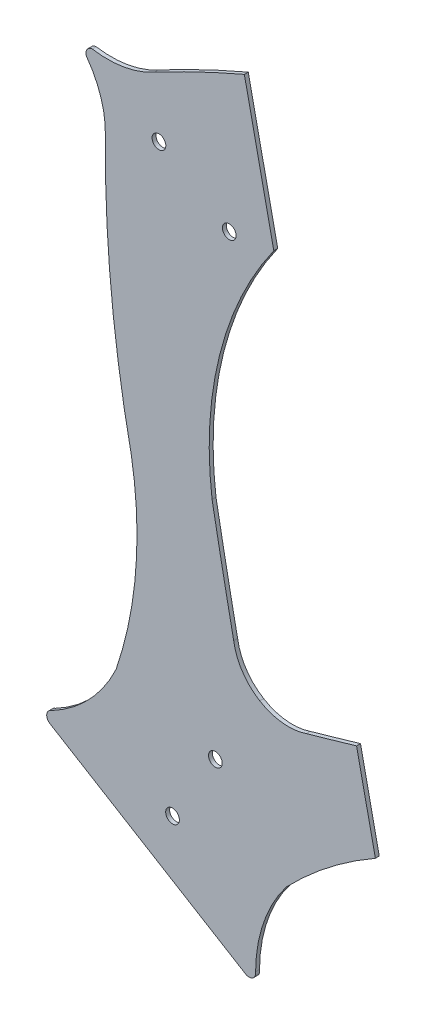
ISO-10303-21;
HEADER;
FILE_DESCRIPTION(('STEP AP214'),'2;1');
FILE_NAME('part.step','',(''),(''),'','','');
FILE_SCHEMA(('AUTOMOTIVE_DESIGN { 1 0 10303 214 1 1 1 1 }'));
ENDSEC;
DATA;
#1=APPLICATION_CONTEXT('core data for automotive mechanical design processes');
#2=APPLICATION_PROTOCOL_DEFINITION('international standard','automotive_design',2000,#1);
#3=PRODUCT_CONTEXT('',#1,'mechanical');
#4=PRODUCT('Part','Part','',(#3));
#5=PRODUCT_RELATED_PRODUCT_CATEGORY('part','',(#4));
#6=PRODUCT_DEFINITION_FORMATION('','',#4);
#7=PRODUCT_DEFINITION_CONTEXT('part definition',#1,'design');
#8=PRODUCT_DEFINITION('design','',#6,#7);
#9=PRODUCT_DEFINITION_SHAPE('','',#8);
#10=(LENGTH_UNIT() NAMED_UNIT(*) SI_UNIT(.MILLI.,.METRE.));
#11=(NAMED_UNIT(*) PLANE_ANGLE_UNIT() SI_UNIT($,.RADIAN.));
#12=(NAMED_UNIT(*) SI_UNIT($,.STERADIAN.) SOLID_ANGLE_UNIT());
#13=UNCERTAINTY_MEASURE_WITH_UNIT(LENGTH_MEASURE(1.E-05),#10,'distance_accuracy_value','');
#14=(GEOMETRIC_REPRESENTATION_CONTEXT(3) GLOBAL_UNCERTAINTY_ASSIGNED_CONTEXT((#13)) GLOBAL_UNIT_ASSIGNED_CONTEXT((#10,
#11,#12)) REPRESENTATION_CONTEXT('',''));
#15=CARTESIAN_POINT('',(0.,0.,0.));
#16=DIRECTION('',(0.,0.,1.));
#17=DIRECTION('',(1.,0.,0.));
#18=AXIS2_PLACEMENT_3D('',#15,#16,#17);
#19=CARTESIAN_POINT('',(-681.623414978373,723.91457598848,0.));
#20=DIRECTION('',(-0.9779411440759,-0.208880632715241,0.));
#21=DIRECTION('',(0.208880632715241,-0.9779411440759,0.));
#22=AXIS2_PLACEMENT_3D('',#19,#20,#21);
#23=PLANE('',#22);
#24=DIRECTION('',(0.208880632715241,-0.9779411440759,0.));
#25=VECTOR('',#24,1.);
#26=CARTESIAN_POINT('',(-124.231516897274,-1885.69294684576,6.35));
#27=LINE('',#26,#25);
#28=CARTESIAN_POINT('',(-666.564137408614,653.409776457336,6.35));
#29=VERTEX_POINT('',#28);
#30=CARTESIAN_POINT('',(-618.800167532141,429.787553853849,6.35));
#31=VERTEX_POINT('',#30);
#32=EDGE_CURVE('E42',#29,#31,#27,.T.);
#33=ORIENTED_EDGE('',*,*,#32,.T.);
#34=DIRECTION('',(0.,0.,-1.));
#35=VECTOR('',#34,1.);
#36=CARTESIAN_POINT('',(-618.800167532141,429.787553853849,6.35));
#37=LINE('',#36,#35);
#38=CARTESIAN_POINT('',(-618.800167532141,429.787553853849,0.));
#39=VERTEX_POINT('',#38);
#40=EDGE_CURVE('E257',#31,#39,#37,.T.);
#41=ORIENTED_EDGE('',*,*,#40,.T.);
#42=DIRECTION('',(0.208880632715241,-0.9779411440759,0.));
#43=VECTOR('',#42,1.);
#44=CARTESIAN_POINT('',(-124.231516897274,-1885.69294684576,0.));
#45=LINE('',#44,#43);
#46=CARTESIAN_POINT('',(-666.564137408614,653.409776457336,0.));
#47=VERTEX_POINT('',#46);
#48=EDGE_CURVE('E252',#47,#39,#45,.T.);
#49=ORIENTED_EDGE('',*,*,#48,.F.);
#50=DIRECTION('',(0.,0.,-1.));
#51=VECTOR('',#50,1.);
#52=CARTESIAN_POINT('',(-666.564137408614,653.409776457336,6.35));
#53=LINE('',#52,#51);
#54=EDGE_CURVE('E253',#29,#47,#53,.T.);
#55=ORIENTED_EDGE('',*,*,#54,.F.);
#56=EDGE_LOOP('',(#33,#41,#49,#55));
#57=FACE_BOUND('',#56,.T.);
#58=ADVANCED_FACE('F38',(#57),#23,.F.);
#59=DIRECTION('',(0.,0.,-1.));
#60=VECTOR('',#59,1.);
#61=CARTESIAN_POINT('',(-454.27658818341,-340.481931278848,6.35));
#62=LINE('',#61,#60);
#63=CARTESIAN_POINT('',(-454.27658818341,-340.481931278848,6.35));
#64=VERTEX_POINT('',#63);
#65=CARTESIAN_POINT('',(-454.27658818341,-340.481931278848,0.));
#66=VERTEX_POINT('',#65);
#67=EDGE_CURVE('E256',#64,#66,#62,.T.);
#68=ORIENTED_EDGE('',*,*,#67,.T.);
#69=CARTESIAN_POINT('',(-484.73177670396,-197.896275932631,0.));
#70=VERTEX_POINT('',#69);
#71=EDGE_CURVE('E248',#70,#66,#45,.T.);
#72=ORIENTED_EDGE('',*,*,#71,.F.);
#73=DIRECTION('',(0.,0.,-1.));
#74=VECTOR('',#73,1.);
#75=CARTESIAN_POINT('',(-484.731776703961,-197.896275932631,6.35));
#76=LINE('',#75,#74);
#77=CARTESIAN_POINT('',(-484.73177670396,-197.896275932631,6.35));
#78=VERTEX_POINT('',#77);
#79=EDGE_CURVE('E261',#70,#78,#76,.F.);
#80=ORIENTED_EDGE('',*,*,#79,.T.);
#81=EDGE_CURVE('E284',#78,#64,#27,.T.);
#82=ORIENTED_EDGE('',*,*,#81,.T.);
#83=EDGE_LOOP('',(#68,#72,#80,#82));
#84=FACE_BOUND('',#83,.T.);
#85=ADVANCED_FACE('F281',(#84),#23,.F.);
#86=CARTESIAN_POINT('',(-78.4644200180242,-1875.91745042495,6.35));
#87=DIRECTION('',(0.,0.,1.));
#88=DIRECTION('',(1.,0.,0.));
#89=AXIS2_PLACEMENT_3D('',#86,#87,#88);
#90=PLANE('',#89);
#91=ORIENTED_EDGE('',*,*,#32,.F.);
#92=CARTESIAN_POINT('',(119.286980797572,-1174.67945800018,6.35));
#93=DIRECTION('',(0.,0.,1.));
#94=DIRECTION('',(1.,0.,0.));
#95=AXIS2_PLACEMENT_3D('',#92,#93,#94);
#96=CIRCLE('',#95,1989.84226237292);
#97=CARTESIAN_POINT('',(-812.39893217834,583.56784789499,6.35));
#98=VERTEX_POINT('',#97);
#99=EDGE_CURVE('E234',#29,#98,#96,.T.);
#100=ORIENTED_EDGE('',*,*,#99,.T.);
#101=CARTESIAN_POINT('',(-888.224271947461,719.381638115622,6.35));
#102=DIRECTION('',(0.,0.,1.));
#103=DIRECTION('',(1.,0.,0.));
#104=AXIS2_PLACEMENT_3D('',#101,#102,#103);
#105=CIRCLE('',#104,155.546995358948);
#106=CARTESIAN_POINT('',(-913.022490821715,565.824104578966,6.35));
#107=VERTEX_POINT('',#106);
#108=EDGE_CURVE('E231',#107,#98,#105,.T.);
#109=ORIENTED_EDGE('',*,*,#108,.F.);
#110=CARTESIAN_POINT('',(-912.432675542853,555.028530146276,6.35));
#111=DIRECTION('',(0.,0.,1.));
#112=DIRECTION('',(1.,0.,0.));
#113=AXIS2_PLACEMENT_3D('',#110,#111,#112);
#114=CIRCLE('',#113,10.8116746804051);
#115=CARTESIAN_POINT('',(-922.288483265199,550.583829533849,6.35));
#116=VERTEX_POINT('',#115);
#117=EDGE_CURVE('E229',#107,#116,#114,.T.);
#118=ORIENTED_EDGE('',*,*,#117,.T.);
#119=CARTESIAN_POINT('',(-1047.20495753008,457.897572610737,6.35));
#120=DIRECTION('',(0.,0.,1.));
#121=DIRECTION('',(1.,0.,0.));
#122=AXIS2_PLACEMENT_3D('',#119,#120,#121);
#123=CIRCLE('',#122,155.546995358911);
#124=CARTESIAN_POINT('',(-891.732469267744,453.083721896815,6.35));
#125=VERTEX_POINT('',#124);
#126=EDGE_CURVE('E226',#125,#116,#123,.T.);
#127=ORIENTED_EDGE('',*,*,#126,.F.);
#128=CARTESIAN_POINT('',(1098.02861030919,435.109425632887,6.35));
#129=DIRECTION('',(0.,0.,1.));
#130=DIRECTION('',(1.,0.,0.));
#131=AXIS2_PLACEMENT_3D('',#128,#129,#130);
#132=CIRCLE('',#131,1989.84226237292);
#133=CARTESIAN_POINT('',(-849.784651103336,28.2977643068504,6.35));
#134=VERTEX_POINT('',#133);
#135=EDGE_CURVE('E224',#125,#134,#132,.T.);
#136=ORIENTED_EDGE('',*,*,#135,.T.);
#137=CARTESIAN_POINT('',(-1477.80132834511,-80.2570379180336,6.35));
#138=DIRECTION('',(0.,0.,1.));
#139=DIRECTION('',(1.,0.,0.));
#140=AXIS2_PLACEMENT_3D('',#137,#138,#139);
#141=CIRCLE('',#140,637.329657226047);
#142=CARTESIAN_POINT('',(-874.295393625839,-285.122063577533,6.35));
#143=VERTEX_POINT('',#142);
#144=EDGE_CURVE('E221',#143,#134,#141,.T.);
#145=ORIENTED_EDGE('',*,*,#144,.F.);
#146=CARTESIAN_POINT('',(-1089.81371714235,-185.570016839871,6.35));
#147=DIRECTION('',(0.,0.,1.));
#148=DIRECTION('',(1.,0.,0.));
#149=AXIS2_PLACEMENT_3D('',#146,#147,#148);
#150=CIRCLE('',#149,237.399995326509);
#151=CARTESIAN_POINT('',(-979.108001027171,-395.57716481452,6.35));
#152=VERTEX_POINT('',#151);
#153=EDGE_CURVE('E218',#152,#143,#150,.T.);
#154=ORIENTED_EDGE('',*,*,#153,.F.);
#155=CARTESIAN_POINT('',(-975.988563379412,-405.929044747908,6.35));
#156=DIRECTION('',(0.,0.,1.));
#157=DIRECTION('',(1.,0.,0.));
#158=AXIS2_PLACEMENT_3D('',#155,#156,#157);
#159=CIRCLE('',#158,10.8116746803413);
#160=CARTESIAN_POINT('',(-981.605328779722,-415.167240233575,6.35));
#161=VERTEX_POINT('',#160);
#162=EDGE_CURVE('E216',#152,#161,#159,.T.);
#163=ORIENTED_EDGE('',*,*,#162,.T.);
#164=DIRECTION('',(-0.854464803909357,0.519509286615884,0.));
#165=VECTOR('',#164,1.);
#166=CARTESIAN_POINT('',(326.217496594056,-1210.31538433662,6.35));
#167=LINE('',#166,#165);
#168=CARTESIAN_POINT('',(-664.585529252044,-607.913306709589,6.35));
#169=VERTEX_POINT('',#168);
#170=EDGE_CURVE('E213',#169,#161,#167,.T.);
#171=ORIENTED_EDGE('',*,*,#170,.F.);
#172=CARTESIAN_POINT('',(-658.968763851755,-598.675111223909,6.35));
#173=DIRECTION('',(0.,0.,1.));
#174=DIRECTION('',(1.,0.,0.));
#175=AXIS2_PLACEMENT_3D('',#172,#173,#174);
#176=CIRCLE('',#175,10.811674680341);
#177=CARTESIAN_POINT('',(-648.342686917893,-596.680418668859,6.35));
#178=VERTEX_POINT('',#177);
#179=EDGE_CURVE('E211',#169,#178,#176,.T.);
#180=ORIENTED_EDGE('',*,*,#179,.T.);
#181=CARTESIAN_POINT('',(-410.948325550841,-598.31595286941,6.35));
#182=DIRECTION('',(0.,0.,1.));
#183=DIRECTION('',(1.,0.,0.));
#184=AXIS2_PLACEMENT_3D('',#181,#182,#183);
#185=CIRCLE('',#184,237.39999532644);
#186=CARTESIAN_POINT('',(-598.51699707221,-452.793613537256,6.35));
#187=VERTEX_POINT('',#186);
#188=EDGE_CURVE('E208',#187,#178,#185,.T.);
#189=ORIENTED_EDGE('',*,*,#188,.F.);
#190=CARTESIAN_POINT('',(-138.891220316239,-894.306056534641,6.35));
#191=DIRECTION('',(0.,0.,1.));
#192=DIRECTION('',(1.,0.,0.));
#193=AXIS2_PLACEMENT_3D('',#190,#191,#192);
#194=CIRCLE('',#193,637.329657226191);
#195=EDGE_CURVE('E207',#64,#187,#194,.T.);
#196=ORIENTED_EDGE('',*,*,#195,.F.);
#197=ORIENTED_EDGE('',*,*,#81,.F.);
#198=CARTESIAN_POINT('',(-3342.55021956787,9521.38535501115,6.35));
#199=DIRECTION('',(0.,0.,1.));
#200=DIRECTION('',(1.,0.,0.));
#201=AXIS2_PLACEMENT_3D('',#198,#199,#200);
#202=CIRCLE('',#201,10130.7236500644);
#203=CARTESIAN_POINT('',(-566.141454128297,-221.464127617939,6.35));
#204=VERTEX_POINT('',#203);
#205=EDGE_CURVE('E245',#204,#78,#202,.T.);
#206=ORIENTED_EDGE('',*,*,#205,.F.);
#207=CARTESIAN_POINT('',(-594.986008487911,-136.466289980875,6.35));
#208=DIRECTION('',(0.,0.,1.));
#209=DIRECTION('',(1.,0.,0.));
#210=AXIS2_PLACEMENT_3D('',#207,#208,#209);
#211=CIRCLE('',#210,89.7587918767928);
#212=CARTESIAN_POINT('',(-641.616534423367,-213.162018481076,6.35));
#213=VERTEX_POINT('',#212);
#214=EDGE_CURVE('E243',#213,#204,#211,.T.);
#215=ORIENTED_EDGE('',*,*,#214,.F.);
#216=DIRECTION('',(0.854464804131851,-0.519509286249936,0.));
#217=VECTOR('',#216,1.);
#218=CARTESIAN_POINT('',(507.647640703039,-911.907488681169,6.35));
#219=LINE('',#218,#217);
#220=CARTESIAN_POINT('',(-641.714035163348,-213.102738637609,6.35));
#221=VERTEX_POINT('',#220);
#222=EDGE_CURVE('E241',#221,#213,#219,.T.);
#223=ORIENTED_EDGE('',*,*,#222,.F.);
#224=CARTESIAN_POINT('',(-595.083509227894,-136.407010137407,6.35));
#225=DIRECTION('',(0.,0.,1.));
#226=DIRECTION('',(1.,0.,0.));
#227=AXIS2_PLACEMENT_3D('',#224,#225,#226);
#228=CIRCLE('',#227,89.7587918768622);
#229=CARTESIAN_POINT('',(-683.819844234621,-149.916398308888,6.35));
#230=VERTEX_POINT('',#229);
#231=EDGE_CURVE('E173',#230,#221,#228,.T.);
#232=ORIENTED_EDGE('',*,*,#231,.F.);
#233=CARTESIAN_POINT('',(9243.68810962946,1869.03072827478,6.35));
#234=DIRECTION('',(0.,0.,1.));
#235=DIRECTION('',(1.,0.,0.));
#236=AXIS2_PLACEMENT_3D('',#233,#234,#235);
#237=CIRCLE('',#236,10130.7236500644);
#238=CARTESIAN_POINT('',(-718.862791300978,30.7866693030345,6.35));
#239=VERTEX_POINT('',#238);
#240=EDGE_CURVE('E235',#239,#230,#237,.T.);
#241=ORIENTED_EDGE('',*,*,#240,.F.);
#242=CARTESIAN_POINT('',(-160.827756363036,102.888433076201,6.35));
#243=DIRECTION('',(0.,0.,1.));
#244=DIRECTION('',(1.,0.,0.));
#245=AXIS2_PLACEMENT_3D('',#242,#243,#244);
#246=CIRCLE('',#245,562.673763878541);
#247=EDGE_CURVE('E239',#31,#239,#246,.T.);
#248=ORIENTED_EDGE('',*,*,#247,.F.);
#249=EDGE_LOOP('',(#91,#100,#109,#118,#127,#136,#145,#154,#163,#171,#180,#189,#196,#197,#206,
#215,#223,#232,#241,#248));
#250=FACE_BOUND('',#249,.T.);
#251=CARTESIAN_POINT('',(-690.989487573624,420.392449079547,6.35));
#252=DIRECTION('',(0.,0.,1.));
#253=DIRECTION('',(1.,0.,0.));
#254=AXIS2_PLACEMENT_3D('',#251,#252,#253);
#255=CIRCLE('',#254,11.1125000000012);
#256=CARTESIAN_POINT('',(-679.876987573623,420.392449079547,6.35));
#257=VERTEX_POINT('',#256);
#258=EDGE_CURVE('E194',#257,#257,#255,.T.);
#259=ORIENTED_EDGE('',*,*,#258,.F.);
#260=EDGE_LOOP('',(#259));
#261=FACE_BOUND('',#260,.T.);
#262=CARTESIAN_POINT('',(-782.910544717582,-445.421706661287,6.35));
#263=DIRECTION('',(0.,0.,1.));
#264=DIRECTION('',(1.,0.,0.));
#265=AXIS2_PLACEMENT_3D('',#262,#263,#264);
#266=CIRCLE('',#265,11.1124999999976);
#267=CARTESIAN_POINT('',(-771.798044717585,-445.421706661287,6.35));
#268=VERTEX_POINT('',#267);
#269=EDGE_CURVE('E197',#268,#268,#266,.T.);
#270=ORIENTED_EDGE('',*,*,#269,.F.);
#271=EDGE_LOOP('',(#270));
#272=FACE_BOUND('',#271,.T.);
#273=CARTESIAN_POINT('',(-804.932369175392,489.669012449943,6.35));
#274=DIRECTION('',(0.,0.,1.));
#275=DIRECTION('',(1.,0.,0.));
#276=AXIS2_PLACEMENT_3D('',#273,#274,#275);
#277=CIRCLE('',#276,11.1124999999994);
#278=CARTESIAN_POINT('',(-793.819869175392,489.669012449943,6.35));
#279=VERTEX_POINT('',#278);
#280=EDGE_CURVE('E201',#279,#279,#277,.T.);
#281=ORIENTED_EDGE('',*,*,#280,.F.);
#282=EDGE_LOOP('',(#281));
#283=FACE_BOUND('',#282,.T.);
#284=CARTESIAN_POINT('',(-713.547879556572,-331.29521132194,6.35));
#285=DIRECTION('',(0.,0.,1.));
#286=DIRECTION('',(1.,0.,0.));
#287=AXIS2_PLACEMENT_3D('',#284,#285,#286);
#288=CIRCLE('',#287,11.1124999999994);
#289=CARTESIAN_POINT('',(-702.435379556572,-331.29521132194,6.35));
#290=VERTEX_POINT('',#289);
#291=EDGE_CURVE('E204',#290,#290,#288,.T.);
#292=ORIENTED_EDGE('',*,*,#291,.F.);
#293=EDGE_LOOP('',(#292));
#294=FACE_BOUND('',#293,.T.);
#295=ADVANCED_FACE('F292',(#250,#261,#272,#283,#294),#90,.T.);
#296=CARTESIAN_POINT('',(-78.4644200180242,-1875.91745042495,0.));
#297=DIRECTION('',(0.,0.,1.));
#298=DIRECTION('',(1.,0.,0.));
#299=AXIS2_PLACEMENT_3D('',#296,#297,#298);
#300=PLANE('',#299);
#301=CARTESIAN_POINT('',(-690.989487573624,420.392449079547,0.));
#302=DIRECTION('',(0.,0.,1.));
#303=DIRECTION('',(1.,0.,0.));
#304=AXIS2_PLACEMENT_3D('',#301,#302,#303);
#305=CIRCLE('',#304,11.1125000000012);
#306=CARTESIAN_POINT('',(-679.876987573623,420.392449079547,0.));
#307=VERTEX_POINT('',#306);
#308=EDGE_CURVE('E247',#307,#307,#305,.T.);
#309=ORIENTED_EDGE('',*,*,#308,.T.);
#310=EDGE_LOOP('',(#309));
#311=FACE_BOUND('',#310,.T.);
#312=CARTESIAN_POINT('',(-782.910544717582,-445.421706661287,0.));
#313=DIRECTION('',(0.,0.,1.));
#314=DIRECTION('',(1.,0.,0.));
#315=AXIS2_PLACEMENT_3D('',#312,#313,#314);
#316=CIRCLE('',#315,11.1124999999976);
#317=CARTESIAN_POINT('',(-771.798044717585,-445.421706661287,0.));
#318=VERTEX_POINT('',#317);
#319=EDGE_CURVE('E341',#318,#318,#316,.T.);
#320=ORIENTED_EDGE('',*,*,#319,.T.);
#321=EDGE_LOOP('',(#320));
#322=FACE_BOUND('',#321,.T.);
#323=CARTESIAN_POINT('',(-804.932369175392,489.669012449943,0.));
#324=DIRECTION('',(0.,0.,1.));
#325=DIRECTION('',(1.,0.,0.));
#326=AXIS2_PLACEMENT_3D('',#323,#324,#325);
#327=CIRCLE('',#326,11.1124999999994);
#328=CARTESIAN_POINT('',(-793.819869175392,489.669012449943,0.));
#329=VERTEX_POINT('',#328);
#330=EDGE_CURVE('E345',#329,#329,#327,.T.);
#331=ORIENTED_EDGE('',*,*,#330,.T.);
#332=EDGE_LOOP('',(#331));
#333=FACE_BOUND('',#332,.T.);
#334=CARTESIAN_POINT('',(-713.547879556572,-331.29521132194,0.));
#335=DIRECTION('',(0.,0.,1.));
#336=DIRECTION('',(1.,0.,0.));
#337=AXIS2_PLACEMENT_3D('',#334,#335,#336);
#338=CIRCLE('',#337,11.1124999999994);
#339=CARTESIAN_POINT('',(-702.435379556572,-331.29521132194,0.));
#340=VERTEX_POINT('',#339);
#341=EDGE_CURVE('E272',#340,#340,#338,.T.);
#342=ORIENTED_EDGE('',*,*,#341,.T.);
#343=EDGE_LOOP('',(#342));
#344=FACE_BOUND('',#343,.T.);
#345=CARTESIAN_POINT('',(119.286980797572,-1174.67945800018,0.));
#346=DIRECTION('',(0.,0.,1.));
#347=DIRECTION('',(1.,0.,0.));
#348=AXIS2_PLACEMENT_3D('',#345,#346,#347);
#349=CIRCLE('',#348,1989.84226237292);
#350=CARTESIAN_POINT('',(-812.39893217834,583.56784789499,0.));
#351=VERTEX_POINT('',#350);
#352=EDGE_CURVE('E265',#47,#351,#349,.T.);
#353=ORIENTED_EDGE('',*,*,#352,.F.);
#354=ORIENTED_EDGE('',*,*,#48,.T.);
#355=CARTESIAN_POINT('',(-160.827756363036,102.888433076201,0.));
#356=DIRECTION('',(0.,0.,1.));
#357=DIRECTION('',(1.,0.,0.));
#358=AXIS2_PLACEMENT_3D('',#355,#356,#357);
#359=CIRCLE('',#358,562.673763878541);
#360=CARTESIAN_POINT('',(-718.862791300978,30.7866693030345,0.));
#361=VERTEX_POINT('',#360);
#362=EDGE_CURVE('E189',#39,#361,#359,.T.);
#363=ORIENTED_EDGE('',*,*,#362,.T.);
#364=CARTESIAN_POINT('',(9243.68810962946,1869.03072827478,0.));
#365=DIRECTION('',(0.,0.,1.));
#366=DIRECTION('',(1.,0.,0.));
#367=AXIS2_PLACEMENT_3D('',#364,#365,#366);
#368=CIRCLE('',#367,10130.7236500644);
#369=CARTESIAN_POINT('',(-683.819844234621,-149.916398308888,0.));
#370=VERTEX_POINT('',#369);
#371=EDGE_CURVE('E186',#361,#370,#368,.T.);
#372=ORIENTED_EDGE('',*,*,#371,.T.);
#373=CARTESIAN_POINT('',(-595.083509227894,-136.407010137407,0.));
#374=DIRECTION('',(0.,0.,1.));
#375=DIRECTION('',(1.,0.,0.));
#376=AXIS2_PLACEMENT_3D('',#373,#374,#375);
#377=CIRCLE('',#376,89.7587918768622);
#378=CARTESIAN_POINT('',(-641.714035163348,-213.102738637609,0.));
#379=VERTEX_POINT('',#378);
#380=EDGE_CURVE('E170',#370,#379,#377,.T.);
#381=ORIENTED_EDGE('',*,*,#380,.T.);
#382=DIRECTION('',(0.854464804131851,-0.519509286249936,0.));
#383=VECTOR('',#382,1.);
#384=CARTESIAN_POINT('',(507.647640703039,-911.907488681169,0.));
#385=LINE('',#384,#383);
#386=CARTESIAN_POINT('',(-641.616534423367,-213.162018481076,0.));
#387=VERTEX_POINT('',#386);
#388=EDGE_CURVE('E180',#379,#387,#385,.T.);
#389=ORIENTED_EDGE('',*,*,#388,.T.);
#390=CARTESIAN_POINT('',(-594.986008487911,-136.466289980875,0.));
#391=DIRECTION('',(0.,0.,1.));
#392=DIRECTION('',(1.,0.,0.));
#393=AXIS2_PLACEMENT_3D('',#390,#391,#392);
#394=CIRCLE('',#393,89.7587918767928);
#395=CARTESIAN_POINT('',(-566.141454128297,-221.464127617939,0.));
#396=VERTEX_POINT('',#395);
#397=EDGE_CURVE('E48',#387,#396,#394,.T.);
#398=ORIENTED_EDGE('',*,*,#397,.T.);
#399=CARTESIAN_POINT('',(-3342.55021956787,9521.38535501115,0.));
#400=DIRECTION('',(0.,0.,1.));
#401=DIRECTION('',(1.,0.,0.));
#402=AXIS2_PLACEMENT_3D('',#399,#400,#401);
#403=CIRCLE('',#402,10130.7236500644);
#404=EDGE_CURVE('E11',#396,#70,#403,.T.);
#405=ORIENTED_EDGE('',*,*,#404,.T.);
#406=ORIENTED_EDGE('',*,*,#71,.T.);
#407=CARTESIAN_POINT('',(-138.891220316239,-894.306056534641,0.));
#408=DIRECTION('',(0.,0.,1.));
#409=DIRECTION('',(1.,0.,0.));
#410=AXIS2_PLACEMENT_3D('',#407,#408,#409);
#411=CIRCLE('',#410,637.329657226191);
#412=CARTESIAN_POINT('',(-598.51699707221,-452.793613537256,0.));
#413=VERTEX_POINT('',#412);
#414=EDGE_CURVE('E122',#66,#413,#411,.T.);
#415=ORIENTED_EDGE('',*,*,#414,.T.);
#416=CARTESIAN_POINT('',(-410.948325550841,-598.31595286941,0.));
#417=DIRECTION('',(0.,0.,1.));
#418=DIRECTION('',(1.,0.,0.));
#419=AXIS2_PLACEMENT_3D('',#416,#417,#418);
#420=CIRCLE('',#419,237.39999532644);
#421=CARTESIAN_POINT('',(-648.342686917893,-596.680418668859,0.));
#422=VERTEX_POINT('',#421);
#423=EDGE_CURVE('E271',#413,#422,#420,.T.);
#424=ORIENTED_EDGE('',*,*,#423,.T.);
#425=CARTESIAN_POINT('',(-658.968763851755,-598.675111223909,0.));
#426=DIRECTION('',(0.,0.,1.));
#427=DIRECTION('',(1.,0.,0.));
#428=AXIS2_PLACEMENT_3D('',#425,#426,#427);
#429=CIRCLE('',#428,10.811674680341);
#430=CARTESIAN_POINT('',(-664.585529252044,-607.913306709589,0.));
#431=VERTEX_POINT('',#430);
#432=EDGE_CURVE('E354',#431,#422,#429,.T.);
#433=ORIENTED_EDGE('',*,*,#432,.F.);
#434=DIRECTION('',(-0.854464803909357,0.519509286615884,0.));
#435=VECTOR('',#434,1.);
#436=CARTESIAN_POINT('',(326.217496594056,-1210.31538433662,0.));
#437=LINE('',#436,#435);
#438=CARTESIAN_POINT('',(-981.605328779722,-415.167240233575,0.));
#439=VERTEX_POINT('',#438);
#440=EDGE_CURVE('E357',#431,#439,#437,.T.);
#441=ORIENTED_EDGE('',*,*,#440,.T.);
#442=CARTESIAN_POINT('',(-975.988563379412,-405.929044747908,0.));
#443=DIRECTION('',(0.,0.,1.));
#444=DIRECTION('',(1.,0.,0.));
#445=AXIS2_PLACEMENT_3D('',#442,#443,#444);
#446=CIRCLE('',#445,10.8116746803413);
#447=CARTESIAN_POINT('',(-979.108001027171,-395.57716481452,0.));
#448=VERTEX_POINT('',#447);
#449=EDGE_CURVE('E360',#448,#439,#446,.T.);
#450=ORIENTED_EDGE('',*,*,#449,.F.);
#451=CARTESIAN_POINT('',(-1089.81371714235,-185.570016839871,0.));
#452=DIRECTION('',(0.,0.,1.));
#453=DIRECTION('',(1.,0.,0.));
#454=AXIS2_PLACEMENT_3D('',#451,#452,#453);
#455=CIRCLE('',#454,237.399995326509);
#456=CARTESIAN_POINT('',(-874.295393625839,-285.122063577533,0.));
#457=VERTEX_POINT('',#456);
#458=EDGE_CURVE('E363',#448,#457,#455,.T.);
#459=ORIENTED_EDGE('',*,*,#458,.T.);
#460=CARTESIAN_POINT('',(-1477.80132834511,-80.2570379180336,0.));
#461=DIRECTION('',(0.,0.,1.));
#462=DIRECTION('',(1.,0.,0.));
#463=AXIS2_PLACEMENT_3D('',#460,#461,#462);
#464=CIRCLE('',#463,637.329657226047);
#465=CARTESIAN_POINT('',(-849.784651103336,28.2977643068504,0.));
#466=VERTEX_POINT('',#465);
#467=EDGE_CURVE('E366',#457,#466,#464,.T.);
#468=ORIENTED_EDGE('',*,*,#467,.T.);
#469=CARTESIAN_POINT('',(1098.02861030919,435.109425632887,0.));
#470=DIRECTION('',(0.,0.,1.));
#471=DIRECTION('',(1.,0.,0.));
#472=AXIS2_PLACEMENT_3D('',#469,#470,#471);
#473=CIRCLE('',#472,1989.84226237292);
#474=CARTESIAN_POINT('',(-891.732469267744,453.083721896815,0.));
#475=VERTEX_POINT('',#474);
#476=EDGE_CURVE('E369',#475,#466,#473,.T.);
#477=ORIENTED_EDGE('',*,*,#476,.F.);
#478=CARTESIAN_POINT('',(-1047.20495753008,457.897572610737,0.));
#479=DIRECTION('',(0.,0.,1.));
#480=DIRECTION('',(1.,0.,0.));
#481=AXIS2_PLACEMENT_3D('',#478,#479,#480);
#482=CIRCLE('',#481,155.546995358911);
#483=CARTESIAN_POINT('',(-922.288483265199,550.583829533849,0.));
#484=VERTEX_POINT('',#483);
#485=EDGE_CURVE('E372',#475,#484,#482,.T.);
#486=ORIENTED_EDGE('',*,*,#485,.T.);
#487=CARTESIAN_POINT('',(-912.432675542853,555.028530146276,0.));
#488=DIRECTION('',(0.,0.,1.));
#489=DIRECTION('',(1.,0.,0.));
#490=AXIS2_PLACEMENT_3D('',#487,#488,#489);
#491=CIRCLE('',#490,10.8116746804051);
#492=CARTESIAN_POINT('',(-913.022490821715,565.824104578966,0.));
#493=VERTEX_POINT('',#492);
#494=EDGE_CURVE('E375',#493,#484,#491,.T.);
#495=ORIENTED_EDGE('',*,*,#494,.F.);
#496=CARTESIAN_POINT('',(-888.224271947461,719.381638115622,0.));
#497=DIRECTION('',(0.,0.,1.));
#498=DIRECTION('',(1.,0.,0.));
#499=AXIS2_PLACEMENT_3D('',#496,#497,#498);
#500=CIRCLE('',#499,155.546995358948);
#501=EDGE_CURVE('E267',#493,#351,#500,.T.);
#502=ORIENTED_EDGE('',*,*,#501,.T.);
#503=EDGE_LOOP('',(#353,#354,#363,#372,#381,#389,#398,#405,#406,#415,#424,#433,#441,#450,#459,
#468,#477,#486,#495,#502));
#504=FACE_BOUND('',#503,.T.);
#505=ADVANCED_FACE('F40',(#311,#322,#333,#344,#504),#300,.F.);
#506=CARTESIAN_POINT('',(119.286980797572,-1174.67945800018,6.35));
#507=DIRECTION('',(0.,0.,-1.));
#508=DIRECTION('',(-1.,0.,0.));
#509=AXIS2_PLACEMENT_3D('',#506,#507,#508);
#510=CYLINDRICAL_SURFACE('',#509,1989.84226237292);
#511=ORIENTED_EDGE('',*,*,#99,.F.);
#512=ORIENTED_EDGE('',*,*,#54,.T.);
#513=ORIENTED_EDGE('',*,*,#352,.T.);
#514=DIRECTION('',(0.,0.,-1.));
#515=VECTOR('',#514,1.);
#516=CARTESIAN_POINT('',(-812.39893217834,583.56784789499,6.35));
#517=LINE('',#516,#515);
#518=EDGE_CURVE('E251',#98,#351,#517,.T.);
#519=ORIENTED_EDGE('',*,*,#518,.F.);
#520=EDGE_LOOP('',(#511,#512,#513,#519));
#521=FACE_BOUND('',#520,.T.);
#522=ADVANCED_FACE('F323',(#521),#510,.T.);
#523=CARTESIAN_POINT('',(-888.224271947461,719.381638115622,6.35));
#524=DIRECTION('',(0.,0.,-1.));
#525=DIRECTION('',(-1.,0.,0.));
#526=AXIS2_PLACEMENT_3D('',#523,#524,#525);
#527=CYLINDRICAL_SURFACE('',#526,155.546995358948);
#528=ORIENTED_EDGE('',*,*,#501,.F.);
#529=DIRECTION('',(0.,0.,-1.));
#530=VECTOR('',#529,1.);
#531=CARTESIAN_POINT('',(-913.022490821715,565.824104578966,6.35));
#532=LINE('',#531,#530);
#533=EDGE_CURVE('E384',#107,#493,#532,.T.);
#534=ORIENTED_EDGE('',*,*,#533,.F.);
#535=ORIENTED_EDGE('',*,*,#108,.T.);
#536=ORIENTED_EDGE('',*,*,#518,.T.);
#537=EDGE_LOOP('',(#528,#534,#535,#536));
#538=FACE_BOUND('',#537,.T.);
#539=ADVANCED_FACE('F325',(#538),#527,.F.);
#540=CARTESIAN_POINT('',(-912.432675542853,555.028530146276,6.35));
#541=DIRECTION('',(0.,0.,-1.));
#542=DIRECTION('',(-1.,0.,0.));
#543=AXIS2_PLACEMENT_3D('',#540,#541,#542);
#544=CYLINDRICAL_SURFACE('',#543,10.8116746804051);
#545=ORIENTED_EDGE('',*,*,#494,.T.);
#546=DIRECTION('',(0.,0.,-1.));
#547=VECTOR('',#546,1.);
#548=CARTESIAN_POINT('',(-922.288483265199,550.583829533849,6.35));
#549=LINE('',#548,#547);
#550=EDGE_CURVE('E390',#116,#484,#549,.T.);
#551=ORIENTED_EDGE('',*,*,#550,.F.);
#552=ORIENTED_EDGE('',*,*,#117,.F.);
#553=ORIENTED_EDGE('',*,*,#533,.T.);
#554=EDGE_LOOP('',(#545,#551,#552,#553));
#555=FACE_BOUND('',#554,.T.);
#556=ADVANCED_FACE('F434',(#555),#544,.T.);
#557=CARTESIAN_POINT('',(-1047.20495753008,457.897572610737,6.35));
#558=DIRECTION('',(0.,0.,-1.));
#559=DIRECTION('',(-1.,0.,0.));
#560=AXIS2_PLACEMENT_3D('',#557,#558,#559);
#561=CYLINDRICAL_SURFACE('',#560,155.546995358911);
#562=ORIENTED_EDGE('',*,*,#485,.F.);
#563=DIRECTION('',(0.,0.,-1.));
#564=VECTOR('',#563,1.);
#565=CARTESIAN_POINT('',(-891.732469267744,453.083721896815,6.35));
#566=LINE('',#565,#564);
#567=EDGE_CURVE('E396',#125,#475,#566,.T.);
#568=ORIENTED_EDGE('',*,*,#567,.F.);
#569=ORIENTED_EDGE('',*,*,#126,.T.);
#570=ORIENTED_EDGE('',*,*,#550,.T.);
#571=EDGE_LOOP('',(#562,#568,#569,#570));
#572=FACE_BOUND('',#571,.T.);
#573=ADVANCED_FACE('F437',(#572),#561,.F.);
#574=CARTESIAN_POINT('',(1098.02861030919,435.109425632887,6.35));
#575=DIRECTION('',(0.,0.,-1.));
#576=DIRECTION('',(-1.,0.,0.));
#577=AXIS2_PLACEMENT_3D('',#574,#575,#576);
#578=CYLINDRICAL_SURFACE('',#577,1989.84226237292);
#579=ORIENTED_EDGE('',*,*,#476,.T.);
#580=DIRECTION('',(0.,0.,-1.));
#581=VECTOR('',#580,1.);
#582=CARTESIAN_POINT('',(-849.784651103336,28.2977643068504,6.35));
#583=LINE('',#582,#581);
#584=EDGE_CURVE('E398',#134,#466,#583,.T.);
#585=ORIENTED_EDGE('',*,*,#584,.F.);
#586=ORIENTED_EDGE('',*,*,#135,.F.);
#587=ORIENTED_EDGE('',*,*,#567,.T.);
#588=EDGE_LOOP('',(#579,#585,#586,#587));
#589=FACE_BOUND('',#588,.T.);
#590=ADVANCED_FACE('F441',(#589),#578,.T.);
#591=CARTESIAN_POINT('',(-1477.80132834511,-80.2570379180336,6.35));
#592=DIRECTION('',(0.,0.,-1.));
#593=DIRECTION('',(-1.,0.,0.));
#594=AXIS2_PLACEMENT_3D('',#591,#592,#593);
#595=CYLINDRICAL_SURFACE('',#594,637.329657226047);
#596=ORIENTED_EDGE('',*,*,#467,.F.);
#597=DIRECTION('',(0.,0.,-1.));
#598=VECTOR('',#597,1.);
#599=CARTESIAN_POINT('',(-874.295393625839,-285.122063577533,6.35));
#600=LINE('',#599,#598);
#601=EDGE_CURVE('E400',#143,#457,#600,.T.);
#602=ORIENTED_EDGE('',*,*,#601,.F.);
#603=ORIENTED_EDGE('',*,*,#144,.T.);
#604=ORIENTED_EDGE('',*,*,#584,.T.);
#605=EDGE_LOOP('',(#596,#602,#603,#604));
#606=FACE_BOUND('',#605,.T.);
#607=ADVANCED_FACE('F445',(#606),#595,.F.);
#608=CARTESIAN_POINT('',(-1089.81371714235,-185.570016839871,6.35));
#609=DIRECTION('',(0.,0.,-1.));
#610=DIRECTION('',(-1.,0.,0.));
#611=AXIS2_PLACEMENT_3D('',#608,#609,#610);
#612=CYLINDRICAL_SURFACE('',#611,237.399995326509);
#613=ORIENTED_EDGE('',*,*,#458,.F.);
#614=DIRECTION('',(0.,0.,-1.));
#615=VECTOR('',#614,1.);
#616=CARTESIAN_POINT('',(-979.108001027171,-395.57716481452,6.35));
#617=LINE('',#616,#615);
#618=EDGE_CURVE('E402',#152,#448,#617,.T.);
#619=ORIENTED_EDGE('',*,*,#618,.F.);
#620=ORIENTED_EDGE('',*,*,#153,.T.);
#621=ORIENTED_EDGE('',*,*,#601,.T.);
#622=EDGE_LOOP('',(#613,#619,#620,#621));
#623=FACE_BOUND('',#622,.T.);
#624=ADVANCED_FACE('F449',(#623),#612,.F.);
#625=CARTESIAN_POINT('',(-975.988563379412,-405.929044747908,6.35));
#626=DIRECTION('',(0.,0.,-1.));
#627=DIRECTION('',(-1.,0.,0.));
#628=AXIS2_PLACEMENT_3D('',#625,#626,#627);
#629=CYLINDRICAL_SURFACE('',#628,10.8116746803413);
#630=ORIENTED_EDGE('',*,*,#449,.T.);
#631=DIRECTION('',(0.,0.,-1.));
#632=VECTOR('',#631,1.);
#633=CARTESIAN_POINT('',(-981.605328779722,-415.167240233575,6.35));
#634=LINE('',#633,#632);
#635=EDGE_CURVE('E404',#161,#439,#634,.T.);
#636=ORIENTED_EDGE('',*,*,#635,.F.);
#637=ORIENTED_EDGE('',*,*,#162,.F.);
#638=ORIENTED_EDGE('',*,*,#618,.T.);
#639=EDGE_LOOP('',(#630,#636,#637,#638));
#640=FACE_BOUND('',#639,.T.);
#641=ADVANCED_FACE('F453',(#640),#629,.T.);
#642=CARTESIAN_POINT('',(326.217496594056,-1210.31538433662,6.35));
#643=DIRECTION('',(-0.519509286615884,-0.854464803909357,0.));
#644=DIRECTION('',(0.854464803909357,-0.519509286615884,0.));
#645=AXIS2_PLACEMENT_3D('',#642,#643,#644);
#646=PLANE('',#645);
#647=ORIENTED_EDGE('',*,*,#440,.F.);
#648=DIRECTION('',(0.,0.,-1.));
#649=VECTOR('',#648,1.);
#650=CARTESIAN_POINT('',(-664.585529252044,-607.913306709589,6.35));
#651=LINE('',#650,#649);
#652=EDGE_CURVE('E406',#169,#431,#651,.T.);
#653=ORIENTED_EDGE('',*,*,#652,.F.);
#654=ORIENTED_EDGE('',*,*,#170,.T.);
#655=ORIENTED_EDGE('',*,*,#635,.T.);
#656=EDGE_LOOP('',(#647,#653,#654,#655));
#657=FACE_BOUND('',#656,.T.);
#658=ADVANCED_FACE('F457',(#657),#646,.T.);
#659=CARTESIAN_POINT('',(-658.968763851755,-598.675111223909,6.35));
#660=DIRECTION('',(0.,0.,-1.));
#661=DIRECTION('',(-1.,0.,0.));
#662=AXIS2_PLACEMENT_3D('',#659,#660,#661);
#663=CYLINDRICAL_SURFACE('',#662,10.811674680341);
#664=ORIENTED_EDGE('',*,*,#432,.T.);
#665=DIRECTION('',(0.,0.,-1.));
#666=VECTOR('',#665,1.);
#667=CARTESIAN_POINT('',(-648.342686917893,-596.680418668859,6.35));
#668=LINE('',#667,#666);
#669=EDGE_CURVE('E408',#178,#422,#668,.T.);
#670=ORIENTED_EDGE('',*,*,#669,.F.);
#671=ORIENTED_EDGE('',*,*,#179,.F.);
#672=ORIENTED_EDGE('',*,*,#652,.T.);
#673=EDGE_LOOP('',(#664,#670,#671,#672));
#674=FACE_BOUND('',#673,.T.);
#675=ADVANCED_FACE('F461',(#674),#663,.T.);
#676=CARTESIAN_POINT('',(-410.948325550841,-598.31595286941,6.35));
#677=DIRECTION('',(0.,0.,-1.));
#678=DIRECTION('',(-1.,0.,0.));
#679=AXIS2_PLACEMENT_3D('',#676,#677,#678);
#680=CYLINDRICAL_SURFACE('',#679,237.39999532644);
#681=ORIENTED_EDGE('',*,*,#423,.F.);
#682=DIRECTION('',(0.,0.,-1.));
#683=VECTOR('',#682,1.);
#684=CARTESIAN_POINT('',(-598.51699707221,-452.793613537256,6.35));
#685=LINE('',#684,#683);
#686=EDGE_CURVE('E410',#187,#413,#685,.T.);
#687=ORIENTED_EDGE('',*,*,#686,.F.);
#688=ORIENTED_EDGE('',*,*,#188,.T.);
#689=ORIENTED_EDGE('',*,*,#669,.T.);
#690=EDGE_LOOP('',(#681,#687,#688,#689));
#691=FACE_BOUND('',#690,.T.);
#692=ADVANCED_FACE('F465',(#691),#680,.F.);
#693=CARTESIAN_POINT('',(-138.891220316239,-894.306056534641,6.35));
#694=DIRECTION('',(0.,0.,-1.));
#695=DIRECTION('',(-1.,0.,0.));
#696=AXIS2_PLACEMENT_3D('',#693,#694,#695);
#697=CYLINDRICAL_SURFACE('',#696,637.329657226191);
#698=ORIENTED_EDGE('',*,*,#67,.F.);
#699=ORIENTED_EDGE('',*,*,#195,.T.);
#700=ORIENTED_EDGE('',*,*,#686,.T.);
#701=ORIENTED_EDGE('',*,*,#414,.F.);
#702=EDGE_LOOP('',(#698,#699,#700,#701));
#703=FACE_BOUND('',#702,.T.);
#704=ADVANCED_FACE('F303',(#703),#697,.F.);
#705=CARTESIAN_POINT('',(-3342.55021956787,9521.38535501115,6.35));
#706=DIRECTION('',(0.,0.,-1.));
#707=DIRECTION('',(-1.,0.,0.));
#708=AXIS2_PLACEMENT_3D('',#705,#706,#707);
#709=CYLINDRICAL_SURFACE('',#708,10130.7236500644);
#710=ORIENTED_EDGE('',*,*,#79,.F.);
#711=ORIENTED_EDGE('',*,*,#404,.F.);
#712=DIRECTION('',(0.,0.,-1.));
#713=VECTOR('',#712,1.);
#714=CARTESIAN_POINT('',(-566.141454128297,-221.464127617939,6.35));
#715=LINE('',#714,#713);
#716=EDGE_CURVE('E57',#204,#396,#715,.T.);
#717=ORIENTED_EDGE('',*,*,#716,.F.);
#718=ORIENTED_EDGE('',*,*,#205,.T.);
#719=EDGE_LOOP('',(#710,#711,#717,#718));
#720=FACE_BOUND('',#719,.T.);
#721=ADVANCED_FACE('F289',(#720),#709,.F.);
#722=CARTESIAN_POINT('',(-594.986008487911,-136.466289980875,6.35));
#723=DIRECTION('',(0.,0.,-1.));
#724=DIRECTION('',(-1.,0.,0.));
#725=AXIS2_PLACEMENT_3D('',#722,#723,#724);
#726=CYLINDRICAL_SURFACE('',#725,89.7587918767928);
#727=ORIENTED_EDGE('',*,*,#397,.F.);
#728=DIRECTION('',(0.,0.,-1.));
#729=VECTOR('',#728,1.);
#730=CARTESIAN_POINT('',(-641.616534423367,-213.162018481076,6.35));
#731=LINE('',#730,#729);
#732=EDGE_CURVE('E109',#213,#387,#731,.T.);
#733=ORIENTED_EDGE('',*,*,#732,.F.);
#734=ORIENTED_EDGE('',*,*,#214,.T.);
#735=ORIENTED_EDGE('',*,*,#716,.T.);
#736=EDGE_LOOP('',(#727,#733,#734,#735));
#737=FACE_BOUND('',#736,.T.);
#738=ADVANCED_FACE('F295',(#737),#726,.F.);
#739=CARTESIAN_POINT('',(507.647640703039,-911.907488681169,6.35));
#740=DIRECTION('',(0.519509286249936,0.854464804131851,0.));
#741=DIRECTION('',(-0.854464804131851,0.519509286249936,0.));
#742=AXIS2_PLACEMENT_3D('',#739,#740,#741);
#743=PLANE('',#742);
#744=ORIENTED_EDGE('',*,*,#388,.F.);
#745=DIRECTION('',(0.,0.,-1.));
#746=VECTOR('',#745,1.);
#747=CARTESIAN_POINT('',(-641.714035163348,-213.102738637609,6.35));
#748=LINE('',#747,#746);
#749=EDGE_CURVE('E166',#221,#379,#748,.T.);
#750=ORIENTED_EDGE('',*,*,#749,.F.);
#751=ORIENTED_EDGE('',*,*,#222,.T.);
#752=ORIENTED_EDGE('',*,*,#732,.T.);
#753=EDGE_LOOP('',(#744,#750,#751,#752));
#754=FACE_BOUND('',#753,.T.);
#755=ADVANCED_FACE('F181',(#754),#743,.T.);
#756=CARTESIAN_POINT('',(-595.083509227894,-136.407010137407,6.35));
#757=DIRECTION('',(0.,0.,-1.));
#758=DIRECTION('',(-1.,0.,0.));
#759=AXIS2_PLACEMENT_3D('',#756,#757,#758);
#760=CYLINDRICAL_SURFACE('',#759,89.7587918768622);
#761=ORIENTED_EDGE('',*,*,#380,.F.);
#762=DIRECTION('',(0.,0.,-1.));
#763=VECTOR('',#762,1.);
#764=CARTESIAN_POINT('',(-683.819844234621,-149.916398308888,6.35));
#765=LINE('',#764,#763);
#766=EDGE_CURVE('E177',#230,#370,#765,.T.);
#767=ORIENTED_EDGE('',*,*,#766,.F.);
#768=ORIENTED_EDGE('',*,*,#231,.T.);
#769=ORIENTED_EDGE('',*,*,#749,.T.);
#770=EDGE_LOOP('',(#761,#767,#768,#769));
#771=FACE_BOUND('',#770,.T.);
#772=ADVANCED_FACE('F168',(#771),#760,.F.);
#773=CARTESIAN_POINT('',(9243.68810962946,1869.03072827478,6.35));
#774=DIRECTION('',(0.,0.,-1.));
#775=DIRECTION('',(-1.,0.,0.));
#776=AXIS2_PLACEMENT_3D('',#773,#774,#775);
#777=CYLINDRICAL_SURFACE('',#776,10130.7236500644);
#778=ORIENTED_EDGE('',*,*,#371,.F.);
#779=DIRECTION('',(0.,0.,-1.));
#780=VECTOR('',#779,1.);
#781=CARTESIAN_POINT('',(-718.862791300978,30.7866693030345,6.35));
#782=LINE('',#781,#780);
#783=EDGE_CURVE('E198',#239,#361,#782,.T.);
#784=ORIENTED_EDGE('',*,*,#783,.F.);
#785=ORIENTED_EDGE('',*,*,#240,.T.);
#786=ORIENTED_EDGE('',*,*,#766,.T.);
#787=EDGE_LOOP('',(#778,#784,#785,#786));
#788=FACE_BOUND('',#787,.T.);
#789=ADVANCED_FACE('F321',(#788),#777,.F.);
#790=CARTESIAN_POINT('',(-160.827756363036,102.888433076201,6.35));
#791=DIRECTION('',(0.,0.,-1.));
#792=DIRECTION('',(-1.,0.,0.));
#793=AXIS2_PLACEMENT_3D('',#790,#791,#792);
#794=CYLINDRICAL_SURFACE('',#793,562.673763878541);
#795=ORIENTED_EDGE('',*,*,#40,.F.);
#796=ORIENTED_EDGE('',*,*,#247,.T.);
#797=ORIENTED_EDGE('',*,*,#783,.T.);
#798=ORIENTED_EDGE('',*,*,#362,.F.);
#799=EDGE_LOOP('',(#795,#796,#797,#798));
#800=FACE_BOUND('',#799,.T.);
#801=ADVANCED_FACE('F318',(#800),#794,.F.);
#802=CARTESIAN_POINT('',(-690.989487573624,420.392449079547,6.35));
#803=DIRECTION('',(0.,0.,-1.));
#804=DIRECTION('',(-1.,0.,0.));
#805=AXIS2_PLACEMENT_3D('',#802,#803,#804);
#806=CYLINDRICAL_SURFACE('',#805,11.1125000000012);
#807=ORIENTED_EDGE('',*,*,#258,.T.);
#808=EDGE_LOOP('',(#807));
#809=FACE_BOUND('',#808,.T.);
#810=ORIENTED_EDGE('',*,*,#308,.F.);
#811=EDGE_LOOP('',(#810));
#812=FACE_BOUND('',#811,.T.);
#813=ADVANCED_FACE('F316',(#809,#812),#806,.F.);
#814=CARTESIAN_POINT('',(-782.910544717582,-445.421706661287,6.35));
#815=DIRECTION('',(0.,0.,-1.));
#816=DIRECTION('',(-1.,0.,0.));
#817=AXIS2_PLACEMENT_3D('',#814,#815,#816);
#818=CYLINDRICAL_SURFACE('',#817,11.1124999999976);
#819=ORIENTED_EDGE('',*,*,#269,.T.);
#820=EDGE_LOOP('',(#819));
#821=FACE_BOUND('',#820,.T.);
#822=ORIENTED_EDGE('',*,*,#319,.F.);
#823=EDGE_LOOP('',(#822));
#824=FACE_BOUND('',#823,.T.);
#825=ADVANCED_FACE('F477',(#821,#824),#818,.F.);
#826=CARTESIAN_POINT('',(-804.932369175392,489.669012449943,6.35));
#827=DIRECTION('',(0.,0.,-1.));
#828=DIRECTION('',(-1.,0.,0.));
#829=AXIS2_PLACEMENT_3D('',#826,#827,#828);
#830=CYLINDRICAL_SURFACE('',#829,11.1124999999994);
#831=ORIENTED_EDGE('',*,*,#280,.T.);
#832=EDGE_LOOP('',(#831));
#833=FACE_BOUND('',#832,.T.);
#834=ORIENTED_EDGE('',*,*,#330,.F.);
#835=EDGE_LOOP('',(#834));
#836=FACE_BOUND('',#835,.T.);
#837=ADVANCED_FACE('F474',(#833,#836),#830,.F.);
#838=CARTESIAN_POINT('',(-713.547879556572,-331.29521132194,6.35));
#839=DIRECTION('',(0.,0.,-1.));
#840=DIRECTION('',(-1.,0.,0.));
#841=AXIS2_PLACEMENT_3D('',#838,#839,#840);
#842=CYLINDRICAL_SURFACE('',#841,11.1124999999994);
#843=ORIENTED_EDGE('',*,*,#291,.T.);
#844=EDGE_LOOP('',(#843));
#845=FACE_BOUND('',#844,.T.);
#846=ORIENTED_EDGE('',*,*,#341,.F.);
#847=EDGE_LOOP('',(#846));
#848=FACE_BOUND('',#847,.T.);
#849=ADVANCED_FACE('F312',(#845,#848),#842,.F.);
#850=CLOSED_SHELL('',(#58,#85,#295,#505,#522,#539,#556,#573,#590,#607,#624,#641,#658,#675,#692,
#704,#721,#738,#755,#772,#789,#801,#813,#825,#837,#849));
#851=MANIFOLD_SOLID_BREP('B2',#850);
#852=ADVANCED_BREP_SHAPE_REPRESENTATION('',(#18,#851),#14);
#853=SHAPE_DEFINITION_REPRESENTATION(#9,#852);
ENDSEC;
END-ISO-10303-21;
